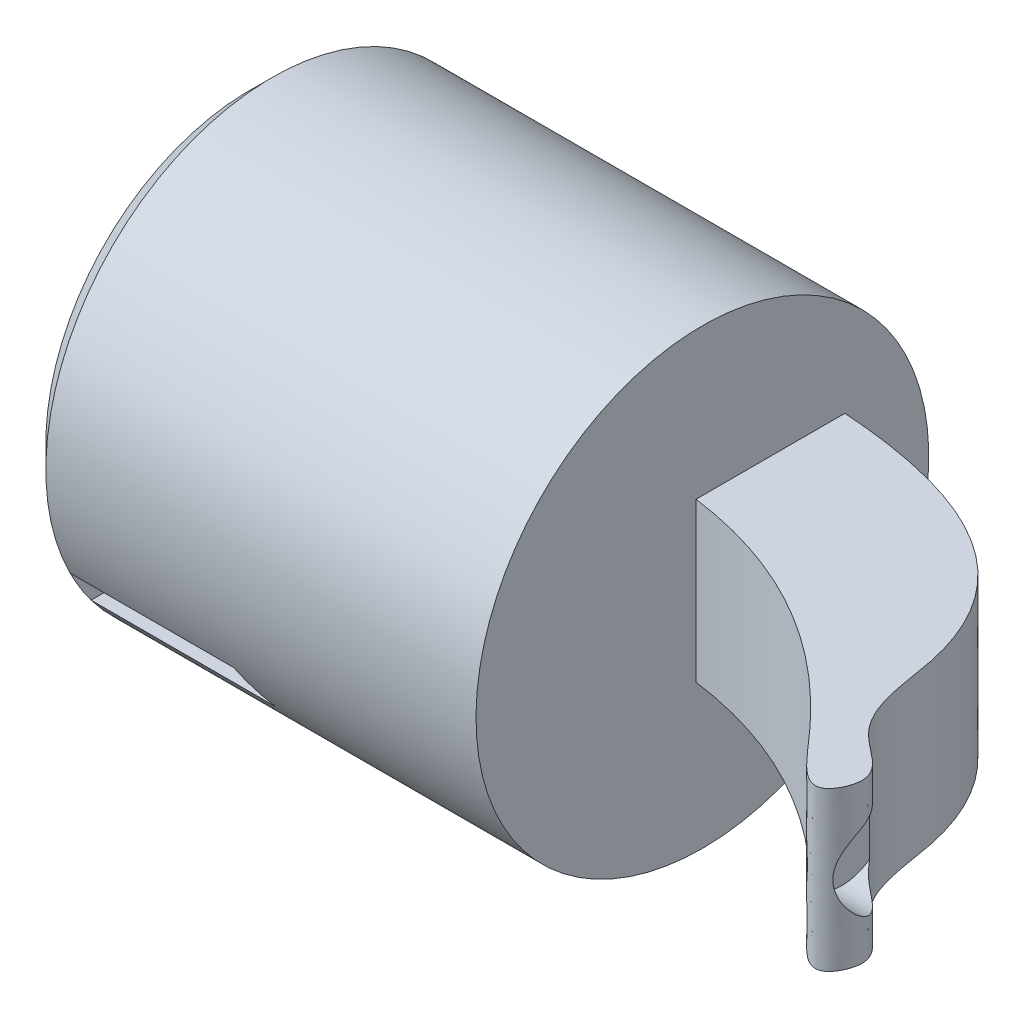
ISO-10303-21;
HEADER;
FILE_DESCRIPTION(('STEP AP214'),'2;1');
FILE_NAME('part.step','',(''),(''),'','','');
FILE_SCHEMA(('AUTOMOTIVE_DESIGN { 1 0 10303 214 1 1 1 1 }'));
ENDSEC;
DATA;
#1=APPLICATION_CONTEXT('core data for automotive mechanical design processes');
#2=APPLICATION_PROTOCOL_DEFINITION('international standard','automotive_design',2000,#1);
#3=PRODUCT_CONTEXT('',#1,'mechanical');
#4=PRODUCT('Part','Part','',(#3));
#5=PRODUCT_RELATED_PRODUCT_CATEGORY('part','',(#4));
#6=PRODUCT_DEFINITION_FORMATION('','',#4);
#7=PRODUCT_DEFINITION_CONTEXT('part definition',#1,'design');
#8=PRODUCT_DEFINITION('design','',#6,#7);
#9=PRODUCT_DEFINITION_SHAPE('','',#8);
#10=(LENGTH_UNIT() NAMED_UNIT(*) SI_UNIT(.MILLI.,.METRE.));
#11=(NAMED_UNIT(*) PLANE_ANGLE_UNIT() SI_UNIT($,.RADIAN.));
#12=(NAMED_UNIT(*) SI_UNIT($,.STERADIAN.) SOLID_ANGLE_UNIT());
#13=UNCERTAINTY_MEASURE_WITH_UNIT(LENGTH_MEASURE(1.E-05),#10,'distance_accuracy_value','');
#14=(GEOMETRIC_REPRESENTATION_CONTEXT(3) GLOBAL_UNCERTAINTY_ASSIGNED_CONTEXT((#13)) GLOBAL_UNIT_ASSIGNED_CONTEXT((#10,
#11,#12)) REPRESENTATION_CONTEXT('',''));
#15=CARTESIAN_POINT('',(0.,0.,0.));
#16=DIRECTION('',(0.,0.,1.));
#17=DIRECTION('',(1.,0.,0.));
#18=AXIS2_PLACEMENT_3D('',#15,#16,#17);
#19=CARTESIAN_POINT('',(-20.,0.,0.));
#20=DIRECTION('',(1.,0.,0.));
#21=DIRECTION('',(0.,0.,-1.));
#22=AXIS2_PLACEMENT_3D('',#19,#20,#21);
#23=CYLINDRICAL_SURFACE('',#22,10.);
#24=DIRECTION('',(1.,0.,0.));
#25=VECTOR('',#24,1.);
#26=CARTESIAN_POINT('',(-20.,-4.5,-8.93028554974588));
#27=LINE('',#26,#25);
#28=CARTESIAN_POINT('',(-19.,-4.5,-8.93028554974588));
#29=VERTEX_POINT('',#28);
#30=CARTESIAN_POINT('',(0.,-4.5,-8.93028554974588));
#31=VERTEX_POINT('',#30);
#32=EDGE_CURVE('E236',#29,#31,#27,.T.);
#33=ORIENTED_EDGE('',*,*,#32,.F.);
#34=CARTESIAN_POINT('',(-19.,0.,0.));
#35=DIRECTION('',(1.,0.,0.));
#36=DIRECTION('',(0.,0.,-1.));
#37=AXIS2_PLACEMENT_3D('',#34,#35,#36);
#38=CIRCLE('',#37,10.);
#39=CARTESIAN_POINT('',(-19.,-4.5,8.93028554974588));
#40=VERTEX_POINT('',#39);
#41=EDGE_CURVE('E199',#29,#40,#38,.T.);
#42=ORIENTED_EDGE('',*,*,#41,.T.);
#43=DIRECTION('',(1.,0.,0.));
#44=VECTOR('',#43,1.);
#45=CARTESIAN_POINT('',(-20.,-4.5,8.93028554974588));
#46=LINE('',#45,#44);
#47=CARTESIAN_POINT('',(-11.7704422227498,-4.5,8.93028554974588));
#48=VERTEX_POINT('',#47);
#49=EDGE_CURVE('E238',#48,#40,#46,.F.);
#50=ORIENTED_EDGE('',*,*,#49,.F.);
#51=CARTESIAN_POINT('',(-2.84015667300399,0.,0.));
#52=DIRECTION('',(-0.707106781186549,0.,-0.707106781186546));
#53=DIRECTION('',(0.707106781186546,0.,-0.707106781186549));
#54=AXIS2_PLACEMENT_3D('',#51,#52,#53);
#55=ELLIPSE('',#54,14.1421356237309,10.);
#56=CARTESIAN_POINT('',(-10.840156673004,-6.,8.));
#57=VERTEX_POINT('',#56);
#58=EDGE_CURVE('E241',#48,#57,#55,.F.);
#59=ORIENTED_EDGE('',*,*,#58,.T.);
#60=DIRECTION('',(1.,0.,0.));
#61=VECTOR('',#60,1.);
#62=CARTESIAN_POINT('',(-20.,-6.,8.));
#63=LINE('',#62,#61);
#64=CARTESIAN_POINT('',(-19.,-6.,8.));
#65=VERTEX_POINT('',#64);
#66=EDGE_CURVE('E224',#57,#65,#63,.F.);
#67=ORIENTED_EDGE('',*,*,#66,.T.);
#68=CARTESIAN_POINT('',(-19.,-6.,-8.));
#69=VERTEX_POINT('',#68);
#70=EDGE_CURVE('E209',#65,#69,#38,.T.);
#71=ORIENTED_EDGE('',*,*,#70,.T.);
#72=DIRECTION('',(1.,0.,0.));
#73=VECTOR('',#72,1.);
#74=CARTESIAN_POINT('',(-20.,-6.,-8.));
#75=LINE('',#74,#73);
#76=CARTESIAN_POINT('',(0.,-6.,-8.));
#77=VERTEX_POINT('',#76);
#78=EDGE_CURVE('E232',#69,#77,#75,.T.);
#79=ORIENTED_EDGE('',*,*,#78,.T.);
#80=CARTESIAN_POINT('',(0.,0.,0.));
#81=DIRECTION('',(1.,0.,0.));
#82=DIRECTION('',(0.,0.,-1.));
#83=AXIS2_PLACEMENT_3D('',#80,#81,#82);
#84=CIRCLE('',#83,10.);
#85=EDGE_CURVE('E248',#31,#77,#84,.T.);
#86=ORIENTED_EDGE('',*,*,#85,.F.);
#87=EDGE_LOOP('',(#33,#42,#50,#59,#67,#71,#79,#86));
#88=FACE_BOUND('',#87,.T.);
#89=ADVANCED_FACE('F37',(#88),#23,.T.);
#90=CARTESIAN_POINT('',(-20.,0.,0.));
#91=DIRECTION('',(1.,0.,0.));
#92=DIRECTION('',(0.,0.,-1.));
#93=AXIS2_PLACEMENT_3D('',#90,#91,#92);
#94=PLANE('',#93);
#95=CARTESIAN_POINT('',(-20.,0.,0.));
#96=DIRECTION('',(1.,0.,0.));
#97=DIRECTION('',(0.,0.,-1.));
#98=AXIS2_PLACEMENT_3D('',#95,#96,#97);
#99=CIRCLE('',#98,8.99999999999999);
#100=CARTESIAN_POINT('',(-20.,0.,-8.99999999999999));
#101=VERTEX_POINT('',#100);
#102=EDGE_CURVE('E208',#101,#101,#99,.F.);
#103=ORIENTED_EDGE('',*,*,#102,.T.);
#104=EDGE_LOOP('',(#103));
#105=FACE_BOUND('',#104,.T.);
#106=ADVANCED_FACE('F168',(#105),#94,.F.);
#107=CARTESIAN_POINT('',(0.,0.,0.));
#108=DIRECTION('',(1.,0.,0.));
#109=DIRECTION('',(0.,0.,-1.));
#110=AXIS2_PLACEMENT_3D('',#107,#108,#109);
#111=PLANE('',#110);
#112=DIRECTION('',(0.,0.,1.));
#113=VECTOR('',#112,1.);
#114=CARTESIAN_POINT('',(0.,-4.5,0.));
#115=LINE('',#114,#113);
#116=CARTESIAN_POINT('',(0.,-4.5,-2.840156673004));
#117=VERTEX_POINT('',#116);
#118=EDGE_CURVE('E187',#31,#117,#115,.T.);
#119=ORIENTED_EDGE('',*,*,#118,.F.);
#120=ORIENTED_EDGE('',*,*,#85,.T.);
#121=DIRECTION('',(0.,0.,1.));
#122=VECTOR('',#121,1.);
#123=CARTESIAN_POINT('',(0.,-6.,0.));
#124=LINE('',#123,#122);
#125=CARTESIAN_POINT('',(0.,-6.,-2.840156673004));
#126=VERTEX_POINT('',#125);
#127=EDGE_CURVE('E212',#77,#126,#124,.T.);
#128=ORIENTED_EDGE('',*,*,#127,.T.);
#129=DIRECTION('',(0.,1.,0.));
#130=VECTOR('',#129,1.);
#131=CARTESIAN_POINT('',(0.,0.,-2.840156673004));
#132=LINE('',#131,#130);
#133=EDGE_CURVE('E117',#126,#117,#132,.T.);
#134=ORIENTED_EDGE('',*,*,#133,.T.);
#135=EDGE_LOOP('',(#119,#120,#128,#134));
#136=FACE_BOUND('',#135,.T.);
#137=DIRECTION('',(0.,0.,1.));
#138=VECTOR('',#137,1.);
#139=CARTESIAN_POINT('',(0.,3.5,0.));
#140=LINE('',#139,#138);
#141=CARTESIAN_POINT('',(2.18271581364782E-12,3.5,-6.29275669270356));
#142=VERTEX_POINT('',#141);
#143=CARTESIAN_POINT('',(7.79659063004923E-09,3.5,0.279630427000657));
#144=VERTEX_POINT('',#143);
#145=EDGE_CURVE('E192',#142,#144,#140,.T.);
#146=ORIENTED_EDGE('',*,*,#145,.F.);
#147=DIRECTION('',(0.,-1.,0.));
#148=VECTOR('',#147,1.);
#149=CARTESIAN_POINT('',(0.,3.5,-6.2927566927037));
#150=LINE('',#149,#148);
#151=CARTESIAN_POINT('',(2.18271581364782E-12,-3.5,-6.29275669270356));
#152=VERTEX_POINT('',#151);
#153=EDGE_CURVE('E194',#142,#152,#150,.T.);
#154=ORIENTED_EDGE('',*,*,#153,.T.);
#155=DIRECTION('',(0.,0.,1.));
#156=VECTOR('',#155,1.);
#157=CARTESIAN_POINT('',(0.,-3.5,0.));
#158=LINE('',#157,#156);
#159=CARTESIAN_POINT('',(0.,-3.5,0.279630427000657));
#160=VERTEX_POINT('',#159);
#161=EDGE_CURVE('E260',#152,#160,#158,.T.);
#162=ORIENTED_EDGE('',*,*,#161,.T.);
#163=DIRECTION('',(0.,-1.,0.));
#164=VECTOR('',#163,1.);
#165=CARTESIAN_POINT('',(1.17831092105725E-12,3.5,0.279630425949123));
#166=LINE('',#165,#164);
#167=EDGE_CURVE('E196',#160,#144,#166,.F.);
#168=ORIENTED_EDGE('',*,*,#167,.T.);
#169=EDGE_LOOP('',(#146,#154,#162,#168));
#170=FACE_BOUND('',#169,.T.);
#171=ADVANCED_FACE('F173',(#136,#170),#111,.T.);
#172=CARTESIAN_POINT('',(-20.,3.5,4.65255681307783));
#173=CARTESIAN_POINT('',(-8.92959758676972,3.5,0.37591942841262));
#174=CARTESIAN_POINT('',(3.07155870678414,3.5,-4.26028002924073));
#175=CARTESIAN_POINT('',(13.6634586347183,3.5,9.40884358856848));
#176=CARTESIAN_POINT('',(14.9004572713979,3.5,6.7624583743611));
#177=CARTESIAN_POINT('',(11.7502682515813,3.5,5.32965538736912));
#178=CARTESIAN_POINT('',(11.3502341129487,3.5,-9.20396485747473));
#179=CARTESIAN_POINT('',(-5.3320447745173,3.5,-6.72882081056665));
#180=CARTESIAN_POINT('',(-20.,3.5,-4.55254128055919));
#181=B_SPLINE_CURVE_WITH_KNOTS('',3,(#172,#173,#174,#175,#176,#177,#178,#179,#180),
.UNSPECIFIED.,.F.,.F.,(4,1,1,1,1,1,4),(0.,0.42668662794441,0.462560683811324,0.479547875926096,
0.512104811417213,0.571016356390154,1.),.UNSPECIFIED.);
#182=DIRECTION('',(0.,-1.,0.));
#183=VECTOR('',#182,1.);
#184=SURFACE_OF_LINEAR_EXTRUSION('',#181,#183);
#185=DIRECTION('',(0.,-1.,0.));
#186=VECTOR('',#185,1.);
#187=CARTESIAN_POINT('',(12.5,3.5,7.8949827230096));
#188=LINE('',#187,#186);
#189=CARTESIAN_POINT('',(12.5,1.22913140933582,7.8949827230096));
#190=VERTEX_POINT('',#189);
#191=CARTESIAN_POINT('',(12.5,-1.22913140933582,7.8949827230096));
#192=VERTEX_POINT('',#191);
#193=EDGE_CURVE('E52',#190,#192,#188,.T.);
#194=ORIENTED_EDGE('',*,*,#193,.F.);
#195=CARTESIAN_POINT('',(12.5,1.22913140933581,7.8949827230096));
#196=CARTESIAN_POINT('',(12.5285861446286,1.19084534050598,7.92480701340153));
#197=CARTESIAN_POINT('',(12.5565460279016,1.15116845530789,7.95348001045334));
#198=CARTESIAN_POINT('',(12.6109519681136,1.06900158657024,8.00831081883629));
#199=CARTESIAN_POINT('',(12.6373952658226,1.02650676114099,8.03446410117616));
#200=CARTESIAN_POINT('',(12.6887702244759,0.938177689033239,8.08429129732132));
#201=CARTESIAN_POINT('',(12.7136746932401,0.892304221063392,8.10792416851575));
#202=CARTESIAN_POINT('',(12.7610483410878,0.79787248753562,8.15194804434115));
#203=CARTESIAN_POINT('',(12.7835192820133,0.749316203288605,8.17234139940049));
#204=CARTESIAN_POINT('',(12.8343633964751,0.628313567286255,8.21751119666265));
#205=CARTESIAN_POINT('',(12.861177074338,0.55449645067302,8.24045794185236));
#206=CARTESIAN_POINT('',(12.9059957104676,0.402440471771394,8.27789255010093));
#207=CARTESIAN_POINT('',(12.9240437962666,0.32422541525627,8.29242189713323));
#208=CARTESIAN_POINT('',(12.9426314705753,0.204229298748306,8.30721454532567));
#209=CARTESIAN_POINT('',(12.9474161362282,0.163502386908337,8.3109796546615));
#210=CARTESIAN_POINT('',(12.9538178838413,0.0816368772262751,8.31600451608771));
#211=CARTESIAN_POINT('',(12.9554351534991,0.0404983039241521,8.31726441663494));
#212=CARTESIAN_POINT('',(12.9554017151462,-0.0417721116349501,8.31723827498969));
#213=CARTESIAN_POINT('',(12.953751339473,-0.0829039541509845,8.31595249170727));
#214=CARTESIAN_POINT('',(12.9472848467035,-0.164751238605823,8.3108764046536));
#215=CARTESIAN_POINT('',(12.9424687232439,-0.205466679707466,8.30708609584808));
#216=CARTESIAN_POINT('',(12.9254499626251,-0.314821911033039,8.2935390693894));
#217=CARTESIAN_POINT('',(12.910430508311,-0.382752363046221,8.2814566823106));
#218=CARTESIAN_POINT('',(12.8735781464635,-0.515425048346313,8.25090171421599));
#219=CARTESIAN_POINT('',(12.8517199194296,-0.580154381432398,8.23240535843769));
#220=CARTESIAN_POINT('',(12.8057389713006,-0.698486988180538,8.19223395269583));
#221=CARTESIAN_POINT('',(12.7821626818805,-0.75251528247987,8.17116594684501));
#222=CARTESIAN_POINT('',(12.7319117064231,-0.857411717300677,8.12504898720997));
#223=CARTESIAN_POINT('',(12.7052332046827,-0.90827584538322,8.09999511659558));
#224=CARTESIAN_POINT('',(12.649811791531,-1.0060901599591,8.04665857664609));
#225=CARTESIAN_POINT('',(12.6210976695797,-1.05308016309074,8.01841850818872));
#226=CARTESIAN_POINT('',(12.5618327575597,-1.14364069509299,7.95890019194154));
#227=CARTESIAN_POINT('',(12.5312871165622,-1.18722008336779,7.92763032225261));
#228=CARTESIAN_POINT('',(12.5,-1.2291314093358,7.89498272300961));
#229=B_SPLINE_CURVE_WITH_KNOTS('',3,(#195,#196,#197,#198,#199,#200,#201,#202,#203,#204,#205,
#206,#207,#208,#209,#210,#211,#212,#213,#214,#215,#216,#217,#218,#219,#220,#221,#222,#223,#224,
#225,#226,#227,#228),.UNSPECIFIED.,.F.,.F.,(4,2,2,2,2,2,2,2,2,2,2,2,2,2,2,2,4),(0.,
0.168967846834872,0.338233945533021,0.509933105979632,0.681507115557446,0.926118639888705,
1.16951414375472,1.29287967803836,1.41623790155173,1.5395835794988,1.66292950537968,
1.87389629230884,2.08565358326329,2.27314776627185,2.4608750552822,2.64633748928779,
2.83130096827301),.UNSPECIFIED.);
#230=EDGE_CURVE('E11',#190,#192,#229,.T.);
#231=ORIENTED_EDGE('',*,*,#230,.T.);
#232=EDGE_LOOP('',(#194,#231));
#233=FACE_BOUND('',#232,.T.);
#234=DIRECTION('',(0.,-1.,0.));
#235=VECTOR('',#234,1.);
#236=CARTESIAN_POINT('',(12.5,3.5,5.1138064901695));
#237=LINE('',#236,#235);
#238=CARTESIAN_POINT('',(12.5,-1.59741047803439,5.1138064901695));
#239=VERTEX_POINT('',#238);
#240=CARTESIAN_POINT('',(12.5,1.59741047803439,5.1138064901695));
#241=VERTEX_POINT('',#240);
#242=EDGE_CURVE('E112',#239,#241,#237,.F.);
#243=ORIENTED_EDGE('',*,*,#242,.F.);
#244=CARTESIAN_POINT('',(12.5,-1.59741047803439,5.1138064901695));
#245=CARTESIAN_POINT('',(12.5211911867595,-1.61901966694919,5.142484249611));
#246=CARTESIAN_POINT('',(12.5432419008078,-1.63954275518343,5.17133809696802));
#247=CARTESIAN_POINT('',(12.5889751291221,-1.67841985761763,5.22908240815211));
#248=CARTESIAN_POINT('',(12.6126539442666,-1.69677854737718,5.25797265153984));
#249=CARTESIAN_POINT('',(12.661630219566,-1.73141089414499,5.31557969728114));
#250=CARTESIAN_POINT('',(12.6869263740018,-1.74768620202968,5.3442966195634));
#251=CARTESIAN_POINT('',(12.7387553515657,-1.77806022861022,5.40099683997067));
#252=CARTESIAN_POINT('',(12.7652684631682,-1.79218389527738,5.42898482315884));
#253=CARTESIAN_POINT('',(12.8197713464041,-1.81859653584785,5.48439498483096));
#254=CARTESIAN_POINT('',(12.84776147013,-1.83088506959089,5.5118170262178));
#255=CARTESIAN_POINT('',(12.90503727578,-1.85377074508769,5.56598694827724));
#256=CARTESIAN_POINT('',(12.9343227696028,-1.86436813139086,5.59273492595132));
#257=CARTESIAN_POINT('',(13.0194495453759,-1.89253427868878,5.66834938545667));
#258=CARTESIAN_POINT('',(13.0765209045319,-1.90828502269582,5.71650679743957));
#259=CARTESIAN_POINT('',(13.1927348425962,-1.93565231795154,5.81158490763231));
#260=CARTESIAN_POINT('',(13.2518802781907,-1.94726289979808,5.85850373054299));
#261=CARTESIAN_POINT('',(13.3711487889098,-1.96696588436617,5.95209805632084));
#262=CARTESIAN_POINT('',(13.4312737422228,-1.97505042289843,5.99877278821164));
#263=CARTESIAN_POINT('',(13.5515626583249,-1.98796403878397,6.09303643319822));
#264=CARTESIAN_POINT('',(13.6117257665451,-1.99277960501984,6.14062831428314));
#265=CARTESIAN_POINT('',(13.7305433540119,-1.99900512968744,6.23764297306815));
#266=CARTESIAN_POINT('',(13.7892007888808,-2.00042236131665,6.28706161033971));
#267=CARTESIAN_POINT('',(13.9035149632723,-1.99936107636492,6.38906381378114));
#268=CARTESIAN_POINT('',(13.959178570454,-1.99689190693316,6.44163949464405));
#269=CARTESIAN_POINT('',(14.0388578112146,-1.98947618876099,6.52398353490568));
#270=CARTESIAN_POINT('',(14.0648035152762,-1.98638108606813,6.55203890053918));
#271=CARTESIAN_POINT('',(14.1150198843695,-1.97875525009415,6.60943063192971));
#272=CARTESIAN_POINT('',(14.1392899840315,-1.9742240351063,6.63876742465747));
#273=CARTESIAN_POINT('',(14.2086406418827,-1.95819465576924,6.72853060044227));
#274=CARTESIAN_POINT('',(14.2506283461773,-1.94423352282236,6.79107371007776));
#275=CARTESIAN_POINT('',(14.3133624792019,-1.91236245075809,6.90500528907101));
#276=CARTESIAN_POINT('',(14.3367915028774,-1.89624035099407,6.95540425257694));
#277=CARTESIAN_POINT('',(14.3751521775549,-1.85875348650555,7.05751123687157));
#278=CARTESIAN_POINT('',(14.3900846743775,-1.83738924393418,7.10921912682252));
#279=CARTESIAN_POINT('',(14.4113073260404,-1.78965273304861,7.21186804289263));
#280=CARTESIAN_POINT('',(14.4176220437662,-1.76329494321168,7.26281083752614));
#281=CARTESIAN_POINT('',(14.4228092224323,-1.70607082021545,7.36254645715346));
#282=CARTESIAN_POINT('',(14.421666127817,-1.67519519484888,7.41133457452162));
#283=CARTESIAN_POINT('',(14.4149835484305,-1.61573701442364,7.49690496132476));
#284=CARTESIAN_POINT('',(14.4103067782881,-1.58780652871663,7.53422545389926));
#285=CARTESIAN_POINT('',(14.3985366230474,-1.5296111954637,7.60661076509669));
#286=CARTESIAN_POINT('',(14.3914419565597,-1.49934511673861,7.64167437592348));
#287=CARTESIAN_POINT('',(14.3675665542737,-1.40527156062517,7.74334368908304));
#288=CARTESIAN_POINT('',(14.3481999533258,-1.3382219354335,7.80638046262405));
#289=CARTESIAN_POINT('',(14.3054147121639,-1.19324757708308,7.92516692084946));
#290=CARTESIAN_POINT('',(14.2818417646464,-1.11494647249118,7.98039387572834));
#291=CARTESIAN_POINT('',(14.2346023034913,-0.951167883571474,8.07918879216567));
#292=CARTESIAN_POINT('',(14.2109357213523,-0.865683523284023,8.12274541172471));
#293=CARTESIAN_POINT('',(14.1755456699715,-0.723662629091449,8.18264468226204));
#294=CARTESIAN_POINT('',(14.1627954483768,-0.66901910649663,8.20294284715252));
#295=CARTESIAN_POINT('',(14.1392834496735,-0.557749114955091,8.238795229176));
#296=CARTESIAN_POINT('',(14.1285219878738,-0.501122333261595,8.25434869431219));
#297=CARTESIAN_POINT('',(14.1098867445052,-0.386441976483607,8.28044003999897));
#298=CARTESIAN_POINT('',(14.1020039199301,-0.328393491598123,8.29099365877584));
#299=CARTESIAN_POINT('',(14.0898829353662,-0.211221970290252,8.30694400323261));
#300=CARTESIAN_POINT('',(14.08564322452,-0.152099402056448,8.31234292335385));
#301=CARTESIAN_POINT('',(14.0816261252471,-0.0421088231518149,8.31745188656623));
#302=CARTESIAN_POINT('',(14.0812885618809,0.00870674581119186,8.31787621008454));
#303=CARTESIAN_POINT('',(14.0836655838941,0.11014827217493,8.31486048002525));
#304=CARTESIAN_POINT('',(14.0863800106457,0.160774239293038,8.31142062728888));
#305=CARTESIAN_POINT('',(14.0946214377736,0.261468844705294,8.30073368292619));
#306=CARTESIAN_POINT('',(14.1001529505587,0.311536456732431,8.2934804824742));
#307=CARTESIAN_POINT('',(14.1135876780915,0.410685113387284,8.27528168253966));
#308=CARTESIAN_POINT('',(14.1214923597332,0.459765527733413,8.26433379879253));
#309=CARTESIAN_POINT('',(14.1500452283377,0.616534455485068,8.22314182378002));
#310=CARTESIAN_POINT('',(14.1743750548232,0.721743712613454,8.18576509809009));
#311=CARTESIAN_POINT('',(14.2265469039503,0.923901759394205,8.09453689639792));
#312=CARTESIAN_POINT('',(14.254394454385,1.02083713663844,8.04065929665695));
#313=CARTESIAN_POINT('',(14.2952078653846,1.15936057982735,7.94790346407185));
#314=CARTESIAN_POINT('',(14.3087421783384,1.20467513906252,7.91472514127555));
#315=CARTESIAN_POINT('',(14.3347448741604,1.29252679634988,7.84451494142956));
#316=CARTESIAN_POINT('',(14.3472137915372,1.33506528459531,7.80748501765053));
#317=CARTESIAN_POINT('',(14.3702682170335,1.41704555294448,7.7297555405406));
#318=CARTESIAN_POINT('',(14.3808572092201,1.45649298424653,7.68906299071337));
#319=CARTESIAN_POINT('',(14.399163290805,1.53206420351265,7.60410986146141));
#320=CARTESIAN_POINT('',(14.406882645983,1.56819059663083,7.55985213073726));
#321=CARTESIAN_POINT('',(14.4154680054082,1.62112397896408,7.48897282445587));
#322=CARTESIAN_POINT('',(14.4178540963177,1.63923537187581,7.46350070492071));
#323=CARTESIAN_POINT('',(14.4210269512526,1.67428673062548,7.41166532279362));
#324=CARTESIAN_POINT('',(14.4218141510654,1.69122701444001,7.38530230501346));
#325=CARTESIAN_POINT('',(14.4213701489093,1.7238048583138,7.33188090941953));
#326=CARTESIAN_POINT('',(14.4201439298273,1.73944553410344,7.3048244109));
#327=CARTESIAN_POINT('',(14.4154073651006,1.76936627685313,7.25015750590159));
#328=CARTESIAN_POINT('',(14.4118969602831,1.78364630855412,7.22254708509107));
#329=CARTESIAN_POINT('',(14.4023691934058,1.81088839543077,7.16675504387883));
#330=CARTESIAN_POINT('',(14.3963271721859,1.82383588189955,7.13857047300237));
#331=CARTESIAN_POINT('',(14.381647156335,1.84818798351708,7.08219870809169));
#332=CARTESIAN_POINT('',(14.3730083703978,1.85959212682786,7.05401151587981));
#333=CARTESIAN_POINT('',(14.3531793173605,1.8808350385586,6.99795552992239));
#334=CARTESIAN_POINT('',(14.3419895618981,1.8906741202058,6.97008667350493));
#335=CARTESIAN_POINT('',(14.3172093114253,1.90883364996905,6.91491240473717));
#336=CARTESIAN_POINT('',(14.3036173659524,1.91715317435723,6.88760734399924));
#337=CARTESIAN_POINT('',(14.2715196459113,1.93378204615425,6.82871145215318));
#338=CARTESIAN_POINT('',(14.2525704421882,1.94179580489301,6.79727926154799));
#339=CARTESIAN_POINT('',(14.2121026487486,1.95599602594342,6.73567721842047));
#340=CARTESIAN_POINT('',(14.1905826904775,1.96218150882094,6.70550804991873));
#341=CARTESIAN_POINT('',(14.1453603592358,1.97296865672613,6.64634636105317));
#342=CARTESIAN_POINT('',(14.1216485344619,1.97756301429041,6.61735979516522));
#343=CARTESIAN_POINT('',(14.0725694135942,1.9853397284529,6.56065193284566));
#344=CARTESIAN_POINT('',(14.0472024880142,1.98852239983808,6.53293035557677));
#345=CARTESIAN_POINT('',(13.9721469681913,1.9959460384029,6.45456605874507));
#346=CARTESIAN_POINT('',(13.9208087050605,1.99862929408366,6.40535925119665));
#347=CARTESIAN_POINT('',(13.8153516357123,2.00055698179574,6.30982278351794));
#348=CARTESIAN_POINT('',(13.7612272173099,1.99979418120919,6.26349938173338));
#349=CARTESIAN_POINT('',(13.6514766877176,1.99528549877784,6.17266453248555));
#350=CARTESIAN_POINT('',(13.5958483761611,1.99153498878453,6.12815600891469));
#351=CARTESIAN_POINT('',(13.4842730857519,1.98120231509304,6.04012984797902));
#352=CARTESIAN_POINT('',(13.4283270266382,1.97462614127733,5.99661031845324));
#353=CARTESIAN_POINT('',(13.316950086516,1.95852257355761,5.90964729193647));
#354=CARTESIAN_POINT('',(13.2615184975191,1.94900015982231,5.8662037901244));
#355=CARTESIAN_POINT('',(13.1519799799167,1.9266121116802,5.77853674935376));
#356=CARTESIAN_POINT('',(13.0978723817543,1.91374820700411,5.73431362497646));
#357=CARTESIAN_POINT('',(13.0098272983602,1.88901512484011,5.65952444161382));
#358=CARTESIAN_POINT('',(12.9752282427366,1.87826733400325,5.62936922050604));
#359=CARTESIAN_POINT('',(12.9074474035919,1.85474773435193,5.56826259455992));
#360=CARTESIAN_POINT('',(12.8742653580548,1.8419763017995,5.53731133862525));
#361=CARTESIAN_POINT('',(12.8097740843284,1.81412039212066,5.47455266474996));
#362=CARTESIAN_POINT('',(12.7784635024851,1.79903761566564,5.44274589036707));
#363=CARTESIAN_POINT('',(12.7174565023096,1.76618788533934,5.37815083486791));
#364=CARTESIAN_POINT('',(12.6877836188294,1.74839123175271,5.34535538828858));
#365=CARTESIAN_POINT('',(12.6305204710504,1.71007854193785,5.27942443555798));
#366=CARTESIAN_POINT('',(12.6029334852016,1.68955835903204,5.24628848339982));
#367=CARTESIAN_POINT('',(12.5498451243289,1.64564989206418,5.17996034944891));
#368=CARTESIAN_POINT('',(12.5243529435075,1.62224998446769,5.14676851104142));
#369=CARTESIAN_POINT('',(12.4999999999993,1.59741047803369,5.11380649016856));
#370=B_SPLINE_CURVE_WITH_KNOTS('',3,(#244,#245,#246,#247,#248,#249,#250,#251,#252,#253,#254,
#255,#256,#257,#258,#259,#260,#261,#262,#263,#264,#265,#266,#267,#268,#269,#270,#271,#272,#273,
#274,#275,#276,#277,#278,#279,#280,#281,#282,#283,#284,#285,#286,#287,#288,#289,#290,#291,#292,
#293,#294,#295,#296,#297,#298,#299,#300,#301,#302,#303,#304,#305,#306,#307,#308,#309,#310,#311,
#312,#313,#314,#315,#316,#317,#318,#319,#320,#321,#322,#323,#324,#325,#326,#327,#328,#329,#330,
#331,#332,#333,#334,#335,#336,#337,#338,#339,#340,#341,#342,#343,#344,#345,#346,#347,#348,#349,
#350,#351,#352,#353,#354,#355,#356,#357,#358,#359,#360,#361,#362,#363,#364,#365,#366,#367,#368,
#369),.UNSPECIFIED.,.F.,.F.,(4,2,2,2,2,2,2,2,2,2,2,2,2,2,2,2,2,2,2,2,2,2,2,2,2,2,2,2,2,2,2,2,2,
2,2,2,2,2,2,2,2,2,2,2,2,2,2,2,2,2,2,2,2,2,2,2,2,2,2,2,2,2,4),(0.,0.125053516080555,
0.249831738255594,0.374510465638011,0.497610697662251,0.620740408261672,0.743852297447912,
0.97257268978813,1.20162153674874,1.4311786546339,1.6616788796029,1.89168534039256,
2.12113945939671,2.23607702377605,2.35105318186352,2.57946665744516,2.75229295137024,
2.9251020376025,3.09741753752028,3.27009256901984,3.41045529174059,3.55089251712419,
3.83193933058596,4.12705468111041,4.42245581227333,4.60125235746256,4.78007722576276,
4.95833539676929,5.1365176464122,5.28873779129198,5.44095002486927,5.59340684249588,
5.74595809085498,6.08691398881241,6.42841249398493,6.60155491276635,6.77460994966161,
6.94734083712467,7.11993505029783,7.21391168883428,7.30786271003217,7.40158156787887,
7.49530285364984,7.58995906882646,7.68464415767565,7.77931027259706,7.87403374421715,
7.98655406121007,8.09913454818345,8.21222542547213,8.32529107232731,8.53845824914547,
8.75207303100775,8.9660193604805,9.17951438375295,9.39265047988369,9.60567646471921,
9.7470330106504,9.88836330449081,10.0295901033696,10.1724910573818,10.3156121343622,
10.4593311076004),.UNSPECIFIED.);
#371=EDGE_CURVE('E116',#239,#241,#370,.T.);
#372=ORIENTED_EDGE('',*,*,#371,.T.);
#373=EDGE_LOOP('',(#243,#372));
#374=FACE_BOUND('',#373,.T.);
#375=ORIENTED_EDGE('',*,*,#167,.F.);
#376=CARTESIAN_POINT('',(-20.,-3.5,4.65255681307783));
#377=CARTESIAN_POINT('',(-8.92959758676972,-3.5,0.37591942841262));
#378=CARTESIAN_POINT('',(3.07155870678414,-3.5,-4.26028002924073));
#379=CARTESIAN_POINT('',(13.6634586347183,-3.5,9.40884358856848));
#380=CARTESIAN_POINT('',(14.9004572713979,-3.5,6.7624583743611));
#381=CARTESIAN_POINT('',(11.7502682515813,-3.5,5.32965538736912));
#382=CARTESIAN_POINT('',(11.3502341129487,-3.5,-9.20396485747473));
#383=CARTESIAN_POINT('',(-5.3320447745173,-3.5,-6.72882081056665));
#384=CARTESIAN_POINT('',(-20.,-3.5,-4.55254128055919));
#385=B_SPLINE_CURVE_WITH_KNOTS('',3,(#376,#377,#378,#379,#380,#381,#382,#383,#384),
.UNSPECIFIED.,.F.,.F.,(4,1,1,1,1,1,4),(0.,0.42668662794441,0.462560683811324,0.479547875926096,
0.512104811417213,0.571016356390154,1.),.UNSPECIFIED.);
#386=EDGE_CURVE('E242',#160,#152,#385,.T.);
#387=ORIENTED_EDGE('',*,*,#386,.T.);
#388=ORIENTED_EDGE('',*,*,#153,.F.);
#389=EDGE_CURVE('E243',#144,#142,#181,.T.);
#390=ORIENTED_EDGE('',*,*,#389,.F.);
#391=EDGE_LOOP('',(#375,#387,#388,#390));
#392=FACE_BOUND('',#391,.T.);
#393=ADVANCED_FACE('F124',(#233,#374,#392),#184,.F.);
#394=CARTESIAN_POINT('',(13.6039155518946,3.5,6.13484398765629));
#395=DIRECTION('',(0.,1.,0.));
#396=DIRECTION('',(0.,0.,1.));
#397=AXIS2_PLACEMENT_3D('',#394,#395,#396);
#398=PLANE('',#397);
#399=ORIENTED_EDGE('',*,*,#389,.T.);
#400=ORIENTED_EDGE('',*,*,#145,.T.);
#401=EDGE_LOOP('',(#399,#400));
#402=FACE_BOUND('',#401,.T.);
#403=ADVANCED_FACE('F157',(#402),#398,.T.);
#404=CARTESIAN_POINT('',(13.6039155518946,-3.5,6.13484398765629));
#405=DIRECTION('',(0.,1.,0.));
#406=DIRECTION('',(0.,0.,1.));
#407=AXIS2_PLACEMENT_3D('',#404,#405,#406);
#408=PLANE('',#407);
#409=ORIENTED_EDGE('',*,*,#161,.F.);
#410=ORIENTED_EDGE('',*,*,#386,.F.);
#411=EDGE_LOOP('',(#409,#410));
#412=FACE_BOUND('',#411,.T.);
#413=ADVANCED_FACE('F159',(#412),#408,.F.);
#414=CARTESIAN_POINT('',(-19.,0.,0.));
#415=DIRECTION('',(1.,0.,0.));
#416=DIRECTION('',(0.,0.,-1.));
#417=AXIS2_PLACEMENT_3D('',#414,#415,#416);
#418=CONICAL_SURFACE('',#417,10.,0.785398163397451);
#419=ORIENTED_EDGE('',*,*,#102,.F.);
#420=EDGE_LOOP('',(#419));
#421=FACE_BOUND('',#420,.T.);
#422=EDGE_CURVE('E204',#40,#65,#38,.T.);
#423=ORIENTED_EDGE('',*,*,#422,.F.);
#424=ORIENTED_EDGE('',*,*,#41,.F.);
#425=EDGE_CURVE('E202',#69,#29,#38,.T.);
#426=ORIENTED_EDGE('',*,*,#425,.F.);
#427=ORIENTED_EDGE('',*,*,#70,.F.);
#428=EDGE_LOOP('',(#423,#424,#426,#427));
#429=FACE_BOUND('',#428,.T.);
#430=ADVANCED_FACE('F40',(#421,#429),#418,.T.);
#431=CARTESIAN_POINT('',(-19.,-4.5,10.));
#432=DIRECTION('',(1.,0.,0.));
#433=DIRECTION('',(0.,0.,-1.));
#434=AXIS2_PLACEMENT_3D('',#431,#432,#433);
#435=PLANE('',#434);
#436=DIRECTION('',(0.,0.,1.));
#437=VECTOR('',#436,1.);
#438=CARTESIAN_POINT('',(-19.,-4.5,10.));
#439=LINE('',#438,#437);
#440=EDGE_CURVE('E225',#29,#40,#439,.T.);
#441=ORIENTED_EDGE('',*,*,#440,.T.);
#442=ORIENTED_EDGE('',*,*,#422,.T.);
#443=DIRECTION('',(0.,0.,1.));
#444=VECTOR('',#443,1.);
#445=CARTESIAN_POINT('',(-19.,-6.,10.));
#446=LINE('',#445,#444);
#447=EDGE_CURVE('E122',#69,#65,#446,.T.);
#448=ORIENTED_EDGE('',*,*,#447,.F.);
#449=ORIENTED_EDGE('',*,*,#425,.T.);
#450=EDGE_LOOP('',(#441,#442,#448,#449));
#451=FACE_BOUND('',#450,.T.);
#452=ADVANCED_FACE('F152',(#451),#435,.T.);
#453=CARTESIAN_POINT('',(1.68416413903558,-4.5,-4.52432081203959));
#454=DIRECTION('',(-0.707106781186549,0.,-0.707106781186546));
#455=DIRECTION('',(-0.707106781186546,0.,0.707106781186549));
#456=AXIS2_PLACEMENT_3D('',#453,#454,#455);
#457=PLANE('',#456);
#458=DIRECTION('',(0.707106781186546,0.,-0.707106781186549));
#459=VECTOR('',#458,1.);
#460=CARTESIAN_POINT('',(1.68416413903558,-4.5,-4.52432081203959));
#461=LINE('',#460,#459);
#462=EDGE_CURVE('E219',#48,#117,#461,.T.);
#463=ORIENTED_EDGE('',*,*,#462,.T.);
#464=ORIENTED_EDGE('',*,*,#133,.F.);
#465=DIRECTION('',(0.707106781186546,0.,-0.707106781186549));
#466=VECTOR('',#465,1.);
#467=CARTESIAN_POINT('',(1.68416413903558,-6.,-4.52432081203959));
#468=LINE('',#467,#466);
#469=EDGE_CURVE('E216',#57,#126,#468,.T.);
#470=ORIENTED_EDGE('',*,*,#469,.F.);
#471=ORIENTED_EDGE('',*,*,#58,.F.);
#472=EDGE_LOOP('',(#463,#464,#470,#471));
#473=FACE_BOUND('',#472,.T.);
#474=ADVANCED_FACE('F145',(#473),#457,.T.);
#475=CARTESIAN_POINT('',(0.,-4.5,0.));
#476=DIRECTION('',(0.,1.,0.));
#477=DIRECTION('',(0.,0.,1.));
#478=AXIS2_PLACEMENT_3D('',#475,#476,#477);
#479=PLANE('',#478);
#480=ORIENTED_EDGE('',*,*,#49,.T.);
#481=ORIENTED_EDGE('',*,*,#440,.F.);
#482=ORIENTED_EDGE('',*,*,#32,.T.);
#483=ORIENTED_EDGE('',*,*,#118,.T.);
#484=ORIENTED_EDGE('',*,*,#462,.F.);
#485=EDGE_LOOP('',(#480,#481,#482,#483,#484));
#486=FACE_BOUND('',#485,.T.);
#487=ADVANCED_FACE('F141',(#486),#479,.F.);
#488=CARTESIAN_POINT('',(0.,-6.,0.));
#489=DIRECTION('',(0.,1.,0.));
#490=DIRECTION('',(0.,0.,1.));
#491=AXIS2_PLACEMENT_3D('',#488,#489,#490);
#492=PLANE('',#491);
#493=ORIENTED_EDGE('',*,*,#469,.T.);
#494=ORIENTED_EDGE('',*,*,#127,.F.);
#495=ORIENTED_EDGE('',*,*,#78,.F.);
#496=ORIENTED_EDGE('',*,*,#447,.T.);
#497=ORIENTED_EDGE('',*,*,#66,.F.);
#498=EDGE_LOOP('',(#493,#494,#495,#496,#497));
#499=FACE_BOUND('',#498,.T.);
#500=ADVANCED_FACE('F140',(#499),#492,.T.);
#501=CARTESIAN_POINT('',(12.5,0.,6.3172514472265));
#502=DIRECTION('',(1.,0.,0.));
#503=DIRECTION('',(0.,0.,-1.));
#504=AXIS2_PLACEMENT_3D('',#501,#502,#503);
#505=CYLINDRICAL_SURFACE('',#504,2.);
#506=CARTESIAN_POINT('',(12.5,0.,6.3172514472265));
#507=DIRECTION('',(1.,0.,0.));
#508=DIRECTION('',(0.,0.,-1.));
#509=AXIS2_PLACEMENT_3D('',#506,#507,#508);
#510=CIRCLE('',#509,2.);
#511=EDGE_CURVE('E59',#241,#190,#510,.T.);
#512=ORIENTED_EDGE('',*,*,#511,.F.);
#513=ORIENTED_EDGE('',*,*,#371,.F.);
#514=EDGE_CURVE('E64',#192,#239,#510,.T.);
#515=ORIENTED_EDGE('',*,*,#514,.F.);
#516=ORIENTED_EDGE('',*,*,#230,.F.);
#517=EDGE_LOOP('',(#512,#513,#515,#516));
#518=FACE_BOUND('',#517,.T.);
#519=ADVANCED_FACE('F120',(#518),#505,.F.);
#520=CARTESIAN_POINT('',(12.5,0.,6.3172514472265));
#521=DIRECTION('',(1.,0.,0.));
#522=DIRECTION('',(0.,0.,-1.));
#523=AXIS2_PLACEMENT_3D('',#520,#521,#522);
#524=PLANE('',#523);
#525=ORIENTED_EDGE('',*,*,#193,.T.);
#526=ORIENTED_EDGE('',*,*,#514,.T.);
#527=ORIENTED_EDGE('',*,*,#242,.T.);
#528=ORIENTED_EDGE('',*,*,#511,.T.);
#529=EDGE_LOOP('',(#525,#526,#527,#528));
#530=FACE_BOUND('',#529,.T.);
#531=ADVANCED_FACE('F113',(#530),#524,.T.);
#532=CLOSED_SHELL('',(#89,#106,#171,#393,#403,#413,#430,#452,#474,#487,#500,#519,#531));
#533=MANIFOLD_SOLID_BREP('B2',#532);
#534=ADVANCED_BREP_SHAPE_REPRESENTATION('',(#18,#533),#14);
#535=SHAPE_DEFINITION_REPRESENTATION(#9,#534);
ENDSEC;
END-ISO-10303-21;
